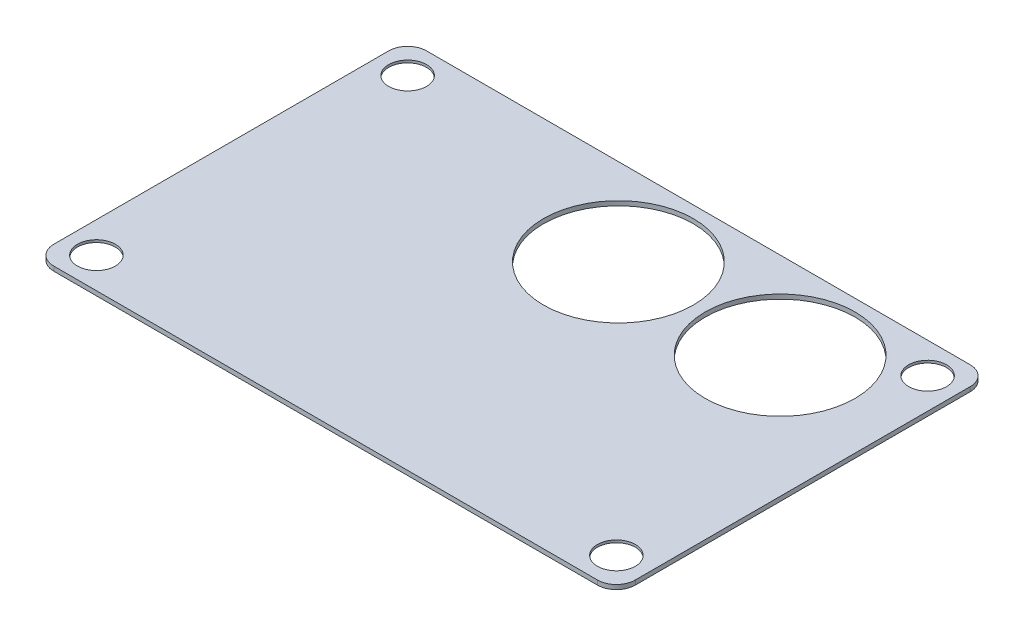
ISO-10303-21;
HEADER;
FILE_DESCRIPTION(('STEP AP214'),'2;1');
FILE_NAME('part.step','',(''),(''),'','','');
FILE_SCHEMA(('AUTOMOTIVE_DESIGN { 1 0 10303 214 1 1 1 1 }'));
ENDSEC;
DATA;
#1=APPLICATION_CONTEXT('core data for automotive mechanical design processes');
#2=APPLICATION_PROTOCOL_DEFINITION('international standard','automotive_design',2000,#1);
#3=PRODUCT_CONTEXT('',#1,'mechanical');
#4=PRODUCT('Part','Part','',(#3));
#5=PRODUCT_RELATED_PRODUCT_CATEGORY('part','',(#4));
#6=PRODUCT_DEFINITION_FORMATION('','',#4);
#7=PRODUCT_DEFINITION_CONTEXT('part definition',#1,'design');
#8=PRODUCT_DEFINITION('design','',#6,#7);
#9=PRODUCT_DEFINITION_SHAPE('','',#8);
#10=(LENGTH_UNIT() NAMED_UNIT(*) SI_UNIT(.MILLI.,.METRE.));
#11=(NAMED_UNIT(*) PLANE_ANGLE_UNIT() SI_UNIT($,.RADIAN.));
#12=(NAMED_UNIT(*) SI_UNIT($,.STERADIAN.) SOLID_ANGLE_UNIT());
#13=UNCERTAINTY_MEASURE_WITH_UNIT(LENGTH_MEASURE(1.E-05),#10,'distance_accuracy_value','');
#14=(GEOMETRIC_REPRESENTATION_CONTEXT(3) GLOBAL_UNCERTAINTY_ASSIGNED_CONTEXT((#13)) GLOBAL_UNIT_ASSIGNED_CONTEXT((#10,
#11,#12)) REPRESENTATION_CONTEXT('',''));
#15=CARTESIAN_POINT('',(0.,0.,0.));
#16=DIRECTION('',(0.,0.,1.));
#17=DIRECTION('',(1.,0.,0.));
#18=AXIS2_PLACEMENT_3D('',#15,#16,#17);
#19=CARTESIAN_POINT('',(73.8725,0.,-4.13));
#20=DIRECTION('',(0.,1.,0.));
#21=DIRECTION('',(0.,0.,1.));
#22=AXIS2_PLACEMENT_3D('',#19,#20,#21);
#23=CYLINDRICAL_SURFACE('',#22,2.54);
#24=CARTESIAN_POINT('',(73.8725,0.6,-4.13));
#25=DIRECTION('',(0.,-1.,0.));
#26=DIRECTION('',(0.,0.,1.));
#27=AXIS2_PLACEMENT_3D('',#24,#25,#26);
#28=CIRCLE('',#27,2.54);
#29=CARTESIAN_POINT('',(73.8725,0.6,-1.59));
#30=VERTEX_POINT('',#29);
#31=EDGE_CURVE('E181',#30,#30,#28,.T.);
#32=ORIENTED_EDGE('',*,*,#31,.F.);
#33=EDGE_LOOP('',(#32));
#34=FACE_BOUND('',#33,.T.);
#35=CARTESIAN_POINT('',(73.8725,0.266625,-4.13));
#36=DIRECTION('',(0.,-1.,0.));
#37=DIRECTION('',(0.,0.,-1.));
#38=AXIS2_PLACEMENT_3D('',#35,#36,#37);
#39=CIRCLE('',#38,2.54);
#40=CARTESIAN_POINT('',(73.8725,0.266625,-6.67));
#41=VERTEX_POINT('',#40);
#42=EDGE_CURVE('E37',#41,#41,#39,.T.);
#43=ORIENTED_EDGE('',*,*,#42,.T.);
#44=EDGE_LOOP('',(#43));
#45=FACE_BOUND('',#44,.T.);
#46=ADVANCED_FACE('F33',(#34,#45),#23,.F.);
#47=CARTESIAN_POINT('',(73.8725,0.,-45.87));
#48=DIRECTION('',(0.,1.,0.));
#49=DIRECTION('',(0.,0.,1.));
#50=AXIS2_PLACEMENT_3D('',#47,#48,#49);
#51=CYLINDRICAL_SURFACE('',#50,2.54);
#52=CARTESIAN_POINT('',(73.8725,0.6,-45.87));
#53=DIRECTION('',(0.,1.,0.));
#54=DIRECTION('',(0.,0.,-1.));
#55=AXIS2_PLACEMENT_3D('',#52,#53,#54);
#56=CIRCLE('',#55,2.54);
#57=CARTESIAN_POINT('',(73.8725,0.6,-48.41));
#58=VERTEX_POINT('',#57);
#59=EDGE_CURVE('E168',#58,#58,#56,.T.);
#60=ORIENTED_EDGE('',*,*,#59,.T.);
#61=EDGE_LOOP('',(#60));
#62=FACE_BOUND('',#61,.T.);
#63=CARTESIAN_POINT('',(73.8725,0.266625,-45.87));
#64=DIRECTION('',(0.,-1.,0.));
#65=DIRECTION('',(0.,0.,-1.));
#66=AXIS2_PLACEMENT_3D('',#63,#64,#65);
#67=CIRCLE('',#66,2.54);
#68=CARTESIAN_POINT('',(73.8725,0.266625,-48.41));
#69=VERTEX_POINT('',#68);
#70=EDGE_CURVE('E166',#69,#69,#67,.F.);
#71=ORIENTED_EDGE('',*,*,#70,.F.);
#72=EDGE_LOOP('',(#71));
#73=FACE_BOUND('',#72,.T.);
#74=ADVANCED_FACE('F226',(#62,#73),#51,.F.);
#75=CARTESIAN_POINT('',(4.12749999999999,0.,-45.87));
#76=DIRECTION('',(0.,1.,0.));
#77=DIRECTION('',(0.,0.,1.));
#78=AXIS2_PLACEMENT_3D('',#75,#76,#77);
#79=CYLINDRICAL_SURFACE('',#78,2.54);
#80=CARTESIAN_POINT('',(4.12749999999999,0.6,-45.87));
#81=DIRECTION('',(0.,-1.,0.));
#82=DIRECTION('',(0.,0.,-1.));
#83=AXIS2_PLACEMENT_3D('',#80,#81,#82);
#84=CIRCLE('',#83,2.54);
#85=CARTESIAN_POINT('',(4.12749999999999,0.6,-48.41));
#86=VERTEX_POINT('',#85);
#87=EDGE_CURVE('E164',#86,#86,#84,.T.);
#88=ORIENTED_EDGE('',*,*,#87,.F.);
#89=EDGE_LOOP('',(#88));
#90=FACE_BOUND('',#89,.T.);
#91=CARTESIAN_POINT('',(4.12749999999999,0.266625,-45.87));
#92=DIRECTION('',(0.,-1.,0.));
#93=DIRECTION('',(0.,0.,-1.));
#94=AXIS2_PLACEMENT_3D('',#91,#92,#93);
#95=CIRCLE('',#94,2.54);
#96=CARTESIAN_POINT('',(4.12749999999999,0.266625,-48.41));
#97=VERTEX_POINT('',#96);
#98=EDGE_CURVE('E162',#97,#97,#95,.T.);
#99=ORIENTED_EDGE('',*,*,#98,.T.);
#100=EDGE_LOOP('',(#99));
#101=FACE_BOUND('',#100,.T.);
#102=ADVANCED_FACE('F232',(#90,#101),#79,.F.);
#103=CARTESIAN_POINT('',(4.12749999999999,0.,-4.13));
#104=DIRECTION('',(0.,1.,0.));
#105=DIRECTION('',(0.,0.,1.));
#106=AXIS2_PLACEMENT_3D('',#103,#104,#105);
#107=CYLINDRICAL_SURFACE('',#106,2.54);
#108=CARTESIAN_POINT('',(4.12749999999999,0.6,-4.13));
#109=DIRECTION('',(0.,1.,0.));
#110=DIRECTION('',(0.,0.,1.));
#111=AXIS2_PLACEMENT_3D('',#108,#109,#110);
#112=CIRCLE('',#111,2.54);
#113=CARTESIAN_POINT('',(4.12749999999999,0.6,-1.59));
#114=VERTEX_POINT('',#113);
#115=EDGE_CURVE('E160',#114,#114,#112,.T.);
#116=ORIENTED_EDGE('',*,*,#115,.T.);
#117=EDGE_LOOP('',(#116));
#118=FACE_BOUND('',#117,.T.);
#119=CARTESIAN_POINT('',(4.12749999999999,0.266625,-4.13));
#120=DIRECTION('',(0.,-1.,0.));
#121=DIRECTION('',(0.,0.,-1.));
#122=AXIS2_PLACEMENT_3D('',#119,#120,#121);
#123=CIRCLE('',#122,2.54);
#124=CARTESIAN_POINT('',(4.12749999999999,0.266625,-6.67));
#125=VERTEX_POINT('',#124);
#126=EDGE_CURVE('E157',#125,#125,#123,.F.);
#127=ORIENTED_EDGE('',*,*,#126,.F.);
#128=EDGE_LOOP('',(#127));
#129=FACE_BOUND('',#128,.T.);
#130=ADVANCED_FACE('F259',(#118,#129),#107,.F.);
#131=CARTESIAN_POINT('',(0.,0.6,0.));
#132=DIRECTION('',(1.,0.,0.));
#133=DIRECTION('',(0.,0.,-1.));
#134=AXIS2_PLACEMENT_3D('',#131,#132,#133);
#135=PLANE('',#134);
#136=DIRECTION('',(0.,0.,1.));
#137=VECTOR('',#136,1.);
#138=CARTESIAN_POINT('',(0.,0.6,0.));
#139=LINE('',#138,#137);
#140=CARTESIAN_POINT('',(0.,0.6,-47.46));
#141=VERTEX_POINT('',#140);
#142=CARTESIAN_POINT('',(0.,0.6,-2.54));
#143=VERTEX_POINT('',#142);
#144=EDGE_CURVE('E127',#141,#143,#139,.T.);
#145=ORIENTED_EDGE('',*,*,#144,.F.);
#146=DIRECTION('',(0.,-1.,0.));
#147=VECTOR('',#146,1.);
#148=CARTESIAN_POINT('',(0.,0.6,-47.46));
#149=LINE('',#148,#147);
#150=CARTESIAN_POINT('',(0.,0.,-47.46));
#151=VERTEX_POINT('',#150);
#152=EDGE_CURVE('E153',#141,#151,#149,.T.);
#153=ORIENTED_EDGE('',*,*,#152,.T.);
#154=DIRECTION('',(0.,0.,1.));
#155=VECTOR('',#154,1.);
#156=CARTESIAN_POINT('',(0.,0.,0.));
#157=LINE('',#156,#155);
#158=CARTESIAN_POINT('',(0.,0.,-2.54));
#159=VERTEX_POINT('',#158);
#160=EDGE_CURVE('E198',#151,#159,#157,.T.);
#161=ORIENTED_EDGE('',*,*,#160,.T.);
#162=DIRECTION('',(0.,-1.,0.));
#163=VECTOR('',#162,1.);
#164=CARTESIAN_POINT('',(0.,0.6,-2.54));
#165=LINE('',#164,#163);
#166=EDGE_CURVE('E151',#159,#143,#165,.F.);
#167=ORIENTED_EDGE('',*,*,#166,.T.);
#168=EDGE_LOOP('',(#145,#153,#161,#167));
#169=FACE_BOUND('',#168,.T.);
#170=ADVANCED_FACE('F223',(#169),#135,.F.);
#171=CARTESIAN_POINT('',(0.,0.6,0.));
#172=DIRECTION('',(0.,0.,-1.));
#173=DIRECTION('',(-1.,0.,0.));
#174=AXIS2_PLACEMENT_3D('',#171,#172,#173);
#175=PLANE('',#174);
#176=DIRECTION('',(1.,0.,0.));
#177=VECTOR('',#176,1.);
#178=CARTESIAN_POINT('',(0.,0.6,0.));
#179=LINE('',#178,#177);
#180=CARTESIAN_POINT('',(2.54,0.6,0.));
#181=VERTEX_POINT('',#180);
#182=CARTESIAN_POINT('',(75.46,0.6,0.));
#183=VERTEX_POINT('',#182);
#184=EDGE_CURVE('E130',#181,#183,#179,.T.);
#185=ORIENTED_EDGE('',*,*,#184,.F.);
#186=DIRECTION('',(0.,-1.,0.));
#187=VECTOR('',#186,1.);
#188=CARTESIAN_POINT('',(2.54,0.6,0.));
#189=LINE('',#188,#187);
#190=CARTESIAN_POINT('',(2.54,0.,0.));
#191=VERTEX_POINT('',#190);
#192=EDGE_CURVE('E11',#181,#191,#189,.T.);
#193=ORIENTED_EDGE('',*,*,#192,.T.);
#194=DIRECTION('',(1.,0.,0.));
#195=VECTOR('',#194,1.);
#196=CARTESIAN_POINT('',(0.,0.,0.));
#197=LINE('',#196,#195);
#198=CARTESIAN_POINT('',(75.46,0.,0.));
#199=VERTEX_POINT('',#198);
#200=EDGE_CURVE('E132',#191,#199,#197,.T.);
#201=ORIENTED_EDGE('',*,*,#200,.T.);
#202=DIRECTION('',(0.,-1.,0.));
#203=VECTOR('',#202,1.);
#204=CARTESIAN_POINT('',(75.46,0.6,0.));
#205=LINE('',#204,#203);
#206=EDGE_CURVE('E42',#199,#183,#205,.F.);
#207=ORIENTED_EDGE('',*,*,#206,.T.);
#208=EDGE_LOOP('',(#185,#193,#201,#207));
#209=FACE_BOUND('',#208,.T.);
#210=ADVANCED_FACE('F207',(#209),#175,.F.);
#211=CARTESIAN_POINT('',(78.,0.6,0.));
#212=DIRECTION('',(-1.,0.,0.));
#213=DIRECTION('',(0.,0.,1.));
#214=AXIS2_PLACEMENT_3D('',#211,#212,#213);
#215=PLANE('',#214);
#216=DIRECTION('',(0.,0.,-1.));
#217=VECTOR('',#216,1.);
#218=CARTESIAN_POINT('',(78.,0.,0.));
#219=LINE('',#218,#217);
#220=CARTESIAN_POINT('',(78.,0.,-2.54));
#221=VERTEX_POINT('',#220);
#222=CARTESIAN_POINT('',(78.,0.,-47.46));
#223=VERTEX_POINT('',#222);
#224=EDGE_CURVE('E128',#221,#223,#219,.T.);
#225=ORIENTED_EDGE('',*,*,#224,.T.);
#226=DIRECTION('',(0.,-1.,0.));
#227=VECTOR('',#226,1.);
#228=CARTESIAN_POINT('',(78.,0.6,-47.46));
#229=LINE('',#228,#227);
#230=CARTESIAN_POINT('',(78.,0.6,-47.46));
#231=VERTEX_POINT('',#230);
#232=EDGE_CURVE('E106',#223,#231,#229,.F.);
#233=ORIENTED_EDGE('',*,*,#232,.T.);
#234=DIRECTION('',(0.,0.,-1.));
#235=VECTOR('',#234,1.);
#236=CARTESIAN_POINT('',(78.,0.6,0.));
#237=LINE('',#236,#235);
#238=CARTESIAN_POINT('',(78.,0.6,-2.54));
#239=VERTEX_POINT('',#238);
#240=EDGE_CURVE('E201',#239,#231,#237,.T.);
#241=ORIENTED_EDGE('',*,*,#240,.F.);
#242=DIRECTION('',(0.,-1.,0.));
#243=VECTOR('',#242,1.);
#244=CARTESIAN_POINT('',(78.,0.6,-2.54));
#245=LINE('',#244,#243);
#246=EDGE_CURVE('E111',#239,#221,#245,.T.);
#247=ORIENTED_EDGE('',*,*,#246,.T.);
#248=EDGE_LOOP('',(#225,#233,#241,#247));
#249=FACE_BOUND('',#248,.T.);
#250=ADVANCED_FACE('F215',(#249),#215,.F.);
#251=CARTESIAN_POINT('',(0.,0.6,-50.));
#252=DIRECTION('',(0.,0.,1.));
#253=DIRECTION('',(1.,0.,0.));
#254=AXIS2_PLACEMENT_3D('',#251,#252,#253);
#255=PLANE('',#254);
#256=DIRECTION('',(-1.,0.,0.));
#257=VECTOR('',#256,1.);
#258=CARTESIAN_POINT('',(0.,0.6,-50.));
#259=LINE('',#258,#257);
#260=CARTESIAN_POINT('',(75.46,0.6,-50.));
#261=VERTEX_POINT('',#260);
#262=CARTESIAN_POINT('',(2.53999999999999,0.6,-50.));
#263=VERTEX_POINT('',#262);
#264=EDGE_CURVE('E121',#261,#263,#259,.T.);
#265=ORIENTED_EDGE('',*,*,#264,.F.);
#266=DIRECTION('',(0.,-1.,0.));
#267=VECTOR('',#266,1.);
#268=CARTESIAN_POINT('',(75.46,0.6,-50.));
#269=LINE('',#268,#267);
#270=CARTESIAN_POINT('',(75.46,0.,-50.));
#271=VERTEX_POINT('',#270);
#272=EDGE_CURVE('E105',#261,#271,#269,.T.);
#273=ORIENTED_EDGE('',*,*,#272,.T.);
#274=DIRECTION('',(-1.,0.,0.));
#275=VECTOR('',#274,1.);
#276=CARTESIAN_POINT('',(0.,0.,-50.));
#277=LINE('',#276,#275);
#278=CARTESIAN_POINT('',(2.53999999999999,0.,-50.));
#279=VERTEX_POINT('',#278);
#280=EDGE_CURVE('E118',#271,#279,#277,.T.);
#281=ORIENTED_EDGE('',*,*,#280,.T.);
#282=DIRECTION('',(0.,-1.,0.));
#283=VECTOR('',#282,1.);
#284=CARTESIAN_POINT('',(2.53999999999999,0.6,-50.));
#285=LINE('',#284,#283);
#286=EDGE_CURVE('E123',#279,#263,#285,.F.);
#287=ORIENTED_EDGE('',*,*,#286,.T.);
#288=EDGE_LOOP('',(#265,#273,#281,#287));
#289=FACE_BOUND('',#288,.T.);
#290=ADVANCED_FACE('F117',(#289),#255,.F.);
#291=CARTESIAN_POINT('',(0.,0.6,0.));
#292=DIRECTION('',(0.,-1.,0.));
#293=DIRECTION('',(0.,0.,-1.));
#294=AXIS2_PLACEMENT_3D('',#291,#292,#293);
#295=PLANE('',#294);
#296=CARTESIAN_POINT('',(39.9125,0.6,-38.3625));
#297=DIRECTION('',(0.,1.,0.));
#298=DIRECTION('',(0.,0.,1.));
#299=AXIS2_PLACEMENT_3D('',#296,#297,#298);
#300=CIRCLE('',#299,10.05);
#301=CARTESIAN_POINT('',(39.9125,0.6,-28.3125));
#302=VERTEX_POINT('',#301);
#303=EDGE_CURVE('E310',#302,#302,#300,.T.);
#304=ORIENTED_EDGE('',*,*,#303,.F.);
#305=EDGE_LOOP('',(#304));
#306=FACE_BOUND('',#305,.T.);
#307=CARTESIAN_POINT('',(61.6,0.6,-38.3625));
#308=DIRECTION('',(0.,1.,0.));
#309=DIRECTION('',(0.,0.,1.));
#310=AXIS2_PLACEMENT_3D('',#307,#308,#309);
#311=CIRCLE('',#310,10.05);
#312=CARTESIAN_POINT('',(61.6,0.6,-28.3125));
#313=VERTEX_POINT('',#312);
#314=EDGE_CURVE('E305',#313,#313,#311,.T.);
#315=ORIENTED_EDGE('',*,*,#314,.F.);
#316=EDGE_LOOP('',(#315));
#317=FACE_BOUND('',#316,.T.);
#318=ORIENTED_EDGE('',*,*,#31,.T.);
#319=EDGE_LOOP('',(#318));
#320=FACE_BOUND('',#319,.T.);
#321=ORIENTED_EDGE('',*,*,#59,.F.);
#322=EDGE_LOOP('',(#321));
#323=FACE_BOUND('',#322,.T.);
#324=ORIENTED_EDGE('',*,*,#87,.T.);
#325=EDGE_LOOP('',(#324));
#326=FACE_BOUND('',#325,.T.);
#327=ORIENTED_EDGE('',*,*,#115,.F.);
#328=EDGE_LOOP('',(#327));
#329=FACE_BOUND('',#328,.T.);
#330=ORIENTED_EDGE('',*,*,#240,.T.);
#331=CARTESIAN_POINT('',(75.46,0.6,-47.46));
#332=DIRECTION('',(0.,-1.,0.));
#333=DIRECTION('',(0.,0.,-1.));
#334=AXIS2_PLACEMENT_3D('',#331,#332,#333);
#335=CIRCLE('',#334,2.54);
#336=EDGE_CURVE('E149',#231,#261,#335,.F.);
#337=ORIENTED_EDGE('',*,*,#336,.T.);
#338=ORIENTED_EDGE('',*,*,#264,.T.);
#339=CARTESIAN_POINT('',(2.53999999999999,0.6,-47.46));
#340=DIRECTION('',(0.,-1.,0.));
#341=DIRECTION('',(0.,0.,-1.));
#342=AXIS2_PLACEMENT_3D('',#339,#340,#341);
#343=CIRCLE('',#342,2.54);
#344=EDGE_CURVE('E147',#263,#141,#343,.F.);
#345=ORIENTED_EDGE('',*,*,#344,.T.);
#346=ORIENTED_EDGE('',*,*,#144,.T.);
#347=CARTESIAN_POINT('',(2.54,0.6,-2.54));
#348=DIRECTION('',(0.,-1.,0.));
#349=DIRECTION('',(0.,0.,-1.));
#350=AXIS2_PLACEMENT_3D('',#347,#348,#349);
#351=CIRCLE('',#350,2.54);
#352=EDGE_CURVE('E56',#143,#181,#351,.F.);
#353=ORIENTED_EDGE('',*,*,#352,.T.);
#354=ORIENTED_EDGE('',*,*,#184,.T.);
#355=CARTESIAN_POINT('',(75.46,0.6,-2.54));
#356=DIRECTION('',(0.,-1.,0.));
#357=DIRECTION('',(0.,0.,-1.));
#358=AXIS2_PLACEMENT_3D('',#355,#356,#357);
#359=CIRCLE('',#358,2.54);
#360=EDGE_CURVE('E144',#183,#239,#359,.F.);
#361=ORIENTED_EDGE('',*,*,#360,.T.);
#362=EDGE_LOOP('',(#330,#337,#338,#345,#346,#353,#354,#361));
#363=FACE_BOUND('',#362,.T.);
#364=ADVANCED_FACE('F213',(#306,#317,#320,#323,#326,#329,#363),#295,.F.);
#365=CARTESIAN_POINT('',(0.,0.,0.));
#366=DIRECTION('',(0.,-1.,0.));
#367=DIRECTION('',(0.,0.,-1.));
#368=AXIS2_PLACEMENT_3D('',#365,#366,#367);
#369=PLANE('',#368);
#370=CARTESIAN_POINT('',(39.9125,0.,-38.3625));
#371=DIRECTION('',(0.,1.,0.));
#372=DIRECTION('',(0.,0.,1.));
#373=AXIS2_PLACEMENT_3D('',#370,#371,#372);
#374=CIRCLE('',#373,10.05);
#375=CARTESIAN_POINT('',(39.9125,0.,-28.3125));
#376=VERTEX_POINT('',#375);
#377=EDGE_CURVE('E284',#376,#376,#374,.T.);
#378=ORIENTED_EDGE('',*,*,#377,.T.);
#379=EDGE_LOOP('',(#378));
#380=FACE_BOUND('',#379,.T.);
#381=CARTESIAN_POINT('',(61.6,0.,-38.3625));
#382=DIRECTION('',(0.,1.,0.));
#383=DIRECTION('',(0.,0.,1.));
#384=AXIS2_PLACEMENT_3D('',#381,#382,#383);
#385=CIRCLE('',#384,10.05);
#386=CARTESIAN_POINT('',(61.6,0.,-28.3125));
#387=VERTEX_POINT('',#386);
#388=EDGE_CURVE('E288',#387,#387,#385,.T.);
#389=ORIENTED_EDGE('',*,*,#388,.T.);
#390=EDGE_LOOP('',(#389));
#391=FACE_BOUND('',#390,.T.);
#392=CARTESIAN_POINT('',(73.8725,0.,-4.13));
#393=DIRECTION('',(0.,1.,0.));
#394=DIRECTION('',(0.,0.,-1.));
#395=AXIS2_PLACEMENT_3D('',#392,#393,#394);
#396=CIRCLE('',#395,3.33);
#397=CARTESIAN_POINT('',(73.8725,0.,-7.46));
#398=VERTEX_POINT('',#397);
#399=EDGE_CURVE('E292',#398,#398,#396,.T.);
#400=ORIENTED_EDGE('',*,*,#399,.T.);
#401=EDGE_LOOP('',(#400));
#402=FACE_BOUND('',#401,.T.);
#403=CARTESIAN_POINT('',(73.8725,0.,-45.87));
#404=DIRECTION('',(0.,-1.,0.));
#405=DIRECTION('',(0.,0.,1.));
#406=AXIS2_PLACEMENT_3D('',#403,#404,#405);
#407=CIRCLE('',#406,3.33);
#408=CARTESIAN_POINT('',(73.8725,0.,-42.54));
#409=VERTEX_POINT('',#408);
#410=EDGE_CURVE('E176',#409,#409,#407,.T.);
#411=ORIENTED_EDGE('',*,*,#410,.F.);
#412=EDGE_LOOP('',(#411));
#413=FACE_BOUND('',#412,.T.);
#414=CARTESIAN_POINT('',(4.12749999999999,0.,-45.87));
#415=DIRECTION('',(0.,1.,0.));
#416=DIRECTION('',(0.,0.,1.));
#417=AXIS2_PLACEMENT_3D('',#414,#415,#416);
#418=CIRCLE('',#417,3.33);
#419=CARTESIAN_POINT('',(4.12749999999999,0.,-42.54));
#420=VERTEX_POINT('',#419);
#421=EDGE_CURVE('E173',#420,#420,#418,.T.);
#422=ORIENTED_EDGE('',*,*,#421,.T.);
#423=EDGE_LOOP('',(#422));
#424=FACE_BOUND('',#423,.T.);
#425=CARTESIAN_POINT('',(4.12749999999999,0.,-4.13));
#426=DIRECTION('',(0.,-1.,0.));
#427=DIRECTION('',(0.,0.,-1.));
#428=AXIS2_PLACEMENT_3D('',#425,#426,#427);
#429=CIRCLE('',#428,3.33);
#430=CARTESIAN_POINT('',(4.12749999999999,0.,-7.46));
#431=VERTEX_POINT('',#430);
#432=EDGE_CURVE('E192',#431,#431,#429,.T.);
#433=ORIENTED_EDGE('',*,*,#432,.F.);
#434=EDGE_LOOP('',(#433));
#435=FACE_BOUND('',#434,.T.);
#436=ORIENTED_EDGE('',*,*,#280,.F.);
#437=CARTESIAN_POINT('',(75.46,0.,-47.46));
#438=DIRECTION('',(0.,-1.,0.));
#439=DIRECTION('',(0.,0.,-1.));
#440=AXIS2_PLACEMENT_3D('',#437,#438,#439);
#441=CIRCLE('',#440,2.54);
#442=EDGE_CURVE('E101',#271,#223,#441,.T.);
#443=ORIENTED_EDGE('',*,*,#442,.T.);
#444=ORIENTED_EDGE('',*,*,#224,.F.);
#445=CARTESIAN_POINT('',(75.46,0.,-2.54));
#446=DIRECTION('',(0.,-1.,0.));
#447=DIRECTION('',(0.,0.,-1.));
#448=AXIS2_PLACEMENT_3D('',#445,#446,#447);
#449=CIRCLE('',#448,2.54);
#450=EDGE_CURVE('E122',#221,#199,#449,.T.);
#451=ORIENTED_EDGE('',*,*,#450,.T.);
#452=ORIENTED_EDGE('',*,*,#200,.F.);
#453=CARTESIAN_POINT('',(2.54,0.,-2.54));
#454=DIRECTION('',(0.,-1.,0.));
#455=DIRECTION('',(0.,0.,-1.));
#456=AXIS2_PLACEMENT_3D('',#453,#454,#455);
#457=CIRCLE('',#456,2.54);
#458=EDGE_CURVE('E138',#191,#159,#457,.T.);
#459=ORIENTED_EDGE('',*,*,#458,.T.);
#460=ORIENTED_EDGE('',*,*,#160,.F.);
#461=CARTESIAN_POINT('',(2.53999999999999,0.,-47.46));
#462=DIRECTION('',(0.,-1.,0.));
#463=DIRECTION('',(0.,0.,-1.));
#464=AXIS2_PLACEMENT_3D('',#461,#462,#463);
#465=CIRCLE('',#464,2.54);
#466=EDGE_CURVE('E112',#151,#279,#465,.T.);
#467=ORIENTED_EDGE('',*,*,#466,.T.);
#468=EDGE_LOOP('',(#436,#443,#444,#451,#452,#459,#460,#467));
#469=FACE_BOUND('',#468,.T.);
#470=ADVANCED_FACE('F125',(#380,#391,#402,#413,#424,#435,#469),#369,.T.);
#471=CARTESIAN_POINT('',(75.46,0.6,-47.46));
#472=DIRECTION('',(0.,-1.,0.));
#473=DIRECTION('',(0.,0.,-1.));
#474=AXIS2_PLACEMENT_3D('',#471,#472,#473);
#475=CYLINDRICAL_SURFACE('',#474,2.54);
#476=ORIENTED_EDGE('',*,*,#336,.F.);
#477=ORIENTED_EDGE('',*,*,#232,.F.);
#478=ORIENTED_EDGE('',*,*,#442,.F.);
#479=ORIENTED_EDGE('',*,*,#272,.F.);
#480=EDGE_LOOP('',(#476,#477,#478,#479));
#481=FACE_BOUND('',#480,.T.);
#482=ADVANCED_FACE('F104',(#481),#475,.T.);
#483=CARTESIAN_POINT('',(2.53999999999999,0.6,-47.46));
#484=DIRECTION('',(0.,-1.,0.));
#485=DIRECTION('',(0.,0.,-1.));
#486=AXIS2_PLACEMENT_3D('',#483,#484,#485);
#487=CYLINDRICAL_SURFACE('',#486,2.54);
#488=ORIENTED_EDGE('',*,*,#344,.F.);
#489=ORIENTED_EDGE('',*,*,#286,.F.);
#490=ORIENTED_EDGE('',*,*,#466,.F.);
#491=ORIENTED_EDGE('',*,*,#152,.F.);
#492=EDGE_LOOP('',(#488,#489,#490,#491));
#493=FACE_BOUND('',#492,.T.);
#494=ADVANCED_FACE('F279',(#493),#487,.T.);
#495=CARTESIAN_POINT('',(2.54,0.6,-2.54));
#496=DIRECTION('',(0.,-1.,0.));
#497=DIRECTION('',(0.,0.,-1.));
#498=AXIS2_PLACEMENT_3D('',#495,#496,#497);
#499=CYLINDRICAL_SURFACE('',#498,2.54);
#500=ORIENTED_EDGE('',*,*,#352,.F.);
#501=ORIENTED_EDGE('',*,*,#166,.F.);
#502=ORIENTED_EDGE('',*,*,#458,.F.);
#503=ORIENTED_EDGE('',*,*,#192,.F.);
#504=EDGE_LOOP('',(#500,#501,#502,#503));
#505=FACE_BOUND('',#504,.T.);
#506=ADVANCED_FACE('F431',(#505),#499,.T.);
#507=CARTESIAN_POINT('',(75.46,0.6,-2.54));
#508=DIRECTION('',(0.,-1.,0.));
#509=DIRECTION('',(0.,0.,-1.));
#510=AXIS2_PLACEMENT_3D('',#507,#508,#509);
#511=CYLINDRICAL_SURFACE('',#510,2.54);
#512=ORIENTED_EDGE('',*,*,#360,.F.);
#513=ORIENTED_EDGE('',*,*,#206,.F.);
#514=ORIENTED_EDGE('',*,*,#450,.F.);
#515=ORIENTED_EDGE('',*,*,#246,.F.);
#516=EDGE_LOOP('',(#512,#513,#514,#515));
#517=FACE_BOUND('',#516,.T.);
#518=ADVANCED_FACE('F35',(#517),#511,.T.);
#519=CARTESIAN_POINT('',(4.12749999999999,0.266625,-4.13));
#520=DIRECTION('',(0.,-1.,0.));
#521=DIRECTION('',(0.,0.,-1.));
#522=AXIS2_PLACEMENT_3D('',#519,#520,#521);
#523=PLANE('',#522);
#524=CARTESIAN_POINT('',(4.12749999999999,0.266625,-4.13));
#525=DIRECTION('',(0.,-1.,0.));
#526=DIRECTION('',(0.,0.,-1.));
#527=AXIS2_PLACEMENT_3D('',#524,#525,#526);
#528=CIRCLE('',#527,3.33);
#529=CARTESIAN_POINT('',(4.12749999999999,0.266625,-7.46));
#530=VERTEX_POINT('',#529);
#531=EDGE_CURVE('E161',#530,#530,#528,.T.);
#532=ORIENTED_EDGE('',*,*,#531,.T.);
#533=EDGE_LOOP('',(#532));
#534=FACE_BOUND('',#533,.T.);
#535=ORIENTED_EDGE('',*,*,#126,.T.);
#536=EDGE_LOOP('',(#535));
#537=FACE_BOUND('',#536,.T.);
#538=ADVANCED_FACE('F261',(#534,#537),#523,.T.);
#539=CARTESIAN_POINT('',(4.12749999999999,0.266625,-4.13));
#540=DIRECTION('',(0.,-1.,0.));
#541=DIRECTION('',(0.,0.,-1.));
#542=AXIS2_PLACEMENT_3D('',#539,#540,#541);
#543=CYLINDRICAL_SURFACE('',#542,3.33);
#544=ORIENTED_EDGE('',*,*,#531,.F.);
#545=EDGE_LOOP('',(#544));
#546=FACE_BOUND('',#545,.T.);
#547=ORIENTED_EDGE('',*,*,#432,.T.);
#548=EDGE_LOOP('',(#547));
#549=FACE_BOUND('',#548,.T.);
#550=ADVANCED_FACE('F255',(#546,#549),#543,.F.);
#551=CARTESIAN_POINT('',(4.12749999999999,0.266625,-45.87));
#552=DIRECTION('',(0.,-1.,0.));
#553=DIRECTION('',(0.,0.,-1.));
#554=AXIS2_PLACEMENT_3D('',#551,#552,#553);
#555=CYLINDRICAL_SURFACE('',#554,3.33);
#556=CARTESIAN_POINT('',(4.12749999999999,0.266625,-45.87));
#557=DIRECTION('',(0.,1.,0.));
#558=DIRECTION('',(0.,0.,1.));
#559=AXIS2_PLACEMENT_3D('',#556,#557,#558);
#560=CIRCLE('',#559,3.33);
#561=CARTESIAN_POINT('',(4.12749999999999,0.266625,-42.54));
#562=VERTEX_POINT('',#561);
#563=EDGE_CURVE('E165',#562,#562,#560,.T.);
#564=ORIENTED_EDGE('',*,*,#563,.T.);
#565=EDGE_LOOP('',(#564));
#566=FACE_BOUND('',#565,.T.);
#567=ORIENTED_EDGE('',*,*,#421,.F.);
#568=EDGE_LOOP('',(#567));
#569=FACE_BOUND('',#568,.T.);
#570=ADVANCED_FACE('F251',(#566,#569),#555,.F.);
#571=CARTESIAN_POINT('',(4.12749999999999,0.266625,-45.87));
#572=DIRECTION('',(0.,-1.,0.));
#573=DIRECTION('',(0.,0.,1.));
#574=AXIS2_PLACEMENT_3D('',#571,#572,#573);
#575=PLANE('',#574);
#576=ORIENTED_EDGE('',*,*,#98,.F.);
#577=EDGE_LOOP('',(#576));
#578=FACE_BOUND('',#577,.T.);
#579=ORIENTED_EDGE('',*,*,#563,.F.);
#580=EDGE_LOOP('',(#579));
#581=FACE_BOUND('',#580,.T.);
#582=ADVANCED_FACE('F245',(#578,#581),#575,.T.);
#583=CARTESIAN_POINT('',(73.8725,0.266625,-45.87));
#584=DIRECTION('',(0.,-1.,0.));
#585=DIRECTION('',(0.,0.,1.));
#586=AXIS2_PLACEMENT_3D('',#583,#584,#585);
#587=PLANE('',#586);
#588=CARTESIAN_POINT('',(73.8725,0.266625,-45.87));
#589=DIRECTION('',(0.,-1.,0.));
#590=DIRECTION('',(0.,0.,1.));
#591=AXIS2_PLACEMENT_3D('',#588,#589,#590);
#592=CIRCLE('',#591,3.33);
#593=CARTESIAN_POINT('',(73.8725,0.266625,-42.54));
#594=VERTEX_POINT('',#593);
#595=EDGE_CURVE('E169',#594,#594,#592,.T.);
#596=ORIENTED_EDGE('',*,*,#595,.T.);
#597=EDGE_LOOP('',(#596));
#598=FACE_BOUND('',#597,.T.);
#599=ORIENTED_EDGE('',*,*,#70,.T.);
#600=EDGE_LOOP('',(#599));
#601=FACE_BOUND('',#600,.T.);
#602=ADVANCED_FACE('F241',(#598,#601),#587,.T.);
#603=CARTESIAN_POINT('',(73.8725,0.266625,-45.87));
#604=DIRECTION('',(0.,-1.,0.));
#605=DIRECTION('',(0.,0.,-1.));
#606=AXIS2_PLACEMENT_3D('',#603,#604,#605);
#607=CYLINDRICAL_SURFACE('',#606,3.33);
#608=ORIENTED_EDGE('',*,*,#595,.F.);
#609=EDGE_LOOP('',(#608));
#610=FACE_BOUND('',#609,.T.);
#611=ORIENTED_EDGE('',*,*,#410,.T.);
#612=EDGE_LOOP('',(#611));
#613=FACE_BOUND('',#612,.T.);
#614=ADVANCED_FACE('F244',(#610,#613),#607,.F.);
#615=CARTESIAN_POINT('',(73.8725,0.266625,-4.13));
#616=DIRECTION('',(0.,-1.,0.));
#617=DIRECTION('',(0.,0.,-1.));
#618=AXIS2_PLACEMENT_3D('',#615,#616,#617);
#619=CYLINDRICAL_SURFACE('',#618,3.33);
#620=CARTESIAN_POINT('',(73.8725,0.266625,-4.13));
#621=DIRECTION('',(0.,1.,0.));
#622=DIRECTION('',(0.,0.,-1.));
#623=AXIS2_PLACEMENT_3D('',#620,#621,#622);
#624=CIRCLE('',#623,3.33);
#625=CARTESIAN_POINT('',(73.8725,0.266625,-7.46));
#626=VERTEX_POINT('',#625);
#627=EDGE_CURVE('E302',#626,#626,#624,.T.);
#628=ORIENTED_EDGE('',*,*,#627,.T.);
#629=EDGE_LOOP('',(#628));
#630=FACE_BOUND('',#629,.T.);
#631=ORIENTED_EDGE('',*,*,#399,.F.);
#632=EDGE_LOOP('',(#631));
#633=FACE_BOUND('',#632,.T.);
#634=ADVANCED_FACE('F239',(#630,#633),#619,.F.);
#635=CARTESIAN_POINT('',(73.8725,0.266625,-4.13));
#636=DIRECTION('',(0.,-1.,0.));
#637=DIRECTION('',(0.,0.,-1.));
#638=AXIS2_PLACEMENT_3D('',#635,#636,#637);
#639=PLANE('',#638);
#640=ORIENTED_EDGE('',*,*,#42,.F.);
#641=EDGE_LOOP('',(#640));
#642=FACE_BOUND('',#641,.T.);
#643=ORIENTED_EDGE('',*,*,#627,.F.);
#644=EDGE_LOOP('',(#643));
#645=FACE_BOUND('',#644,.T.);
#646=ADVANCED_FACE('F337',(#642,#645),#639,.T.);
#647=CARTESIAN_POINT('',(61.6,0.,-38.3625));
#648=DIRECTION('',(0.,1.,0.));
#649=DIRECTION('',(0.,0.,1.));
#650=AXIS2_PLACEMENT_3D('',#647,#648,#649);
#651=CYLINDRICAL_SURFACE('',#650,10.05);
#652=ORIENTED_EDGE('',*,*,#388,.F.);
#653=EDGE_LOOP('',(#652));
#654=FACE_BOUND('',#653,.T.);
#655=ORIENTED_EDGE('',*,*,#314,.T.);
#656=EDGE_LOOP('',(#655));
#657=FACE_BOUND('',#656,.T.);
#658=ADVANCED_FACE('F340',(#654,#657),#651,.F.);
#659=CARTESIAN_POINT('',(39.9125,0.,-38.3625));
#660=DIRECTION('',(0.,1.,0.));
#661=DIRECTION('',(0.,0.,1.));
#662=AXIS2_PLACEMENT_3D('',#659,#660,#661);
#663=CYLINDRICAL_SURFACE('',#662,10.05);
#664=ORIENTED_EDGE('',*,*,#377,.F.);
#665=EDGE_LOOP('',(#664));
#666=FACE_BOUND('',#665,.T.);
#667=ORIENTED_EDGE('',*,*,#303,.T.);
#668=EDGE_LOOP('',(#667));
#669=FACE_BOUND('',#668,.T.);
#670=ADVANCED_FACE('F315',(#666,#669),#663,.F.);
#671=CLOSED_SHELL('',(#46,#74,#102,#130,#170,#210,#250,#290,#364,#470,#482,#494,#506,#518,#538,
#550,#570,#582,#602,#614,#634,#646,#658,#670));
#672=MANIFOLD_SOLID_BREP('B2',#671);
#673=ADVANCED_BREP_SHAPE_REPRESENTATION('',(#18,#672),#14);
#674=SHAPE_DEFINITION_REPRESENTATION(#9,#673);
ENDSEC;
END-ISO-10303-21;
